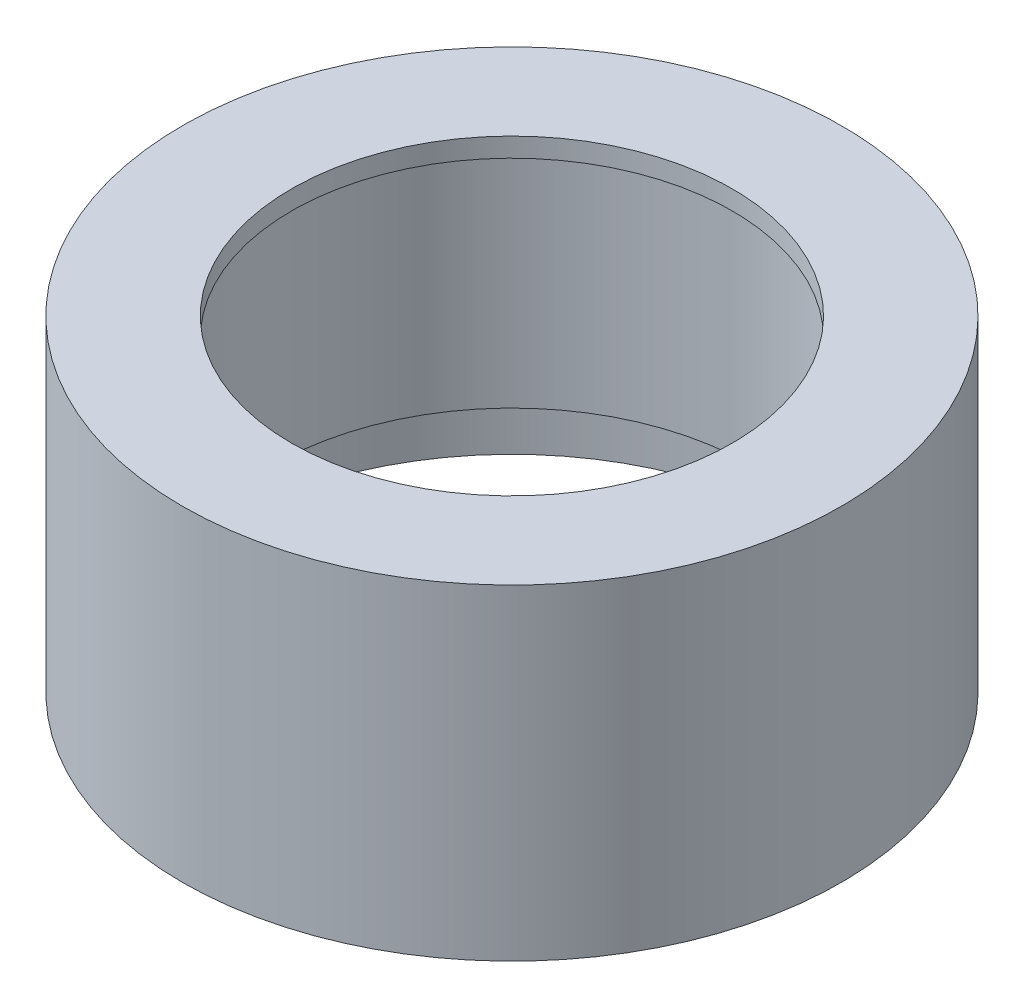
ISO-10303-21;
HEADER;
FILE_DESCRIPTION(('STEP AP214'),'2;1');
FILE_NAME('part.step','',(''),(''),'','','');
FILE_SCHEMA(('AUTOMOTIVE_DESIGN { 1 0 10303 214 1 1 1 1 }'));
ENDSEC;
DATA;
#1=APPLICATION_CONTEXT('core data for automotive mechanical design processes');
#2=APPLICATION_PROTOCOL_DEFINITION('international standard','automotive_design',2000,#1);
#3=PRODUCT_CONTEXT('',#1,'mechanical');
#4=PRODUCT('Part','Part','',(#3));
#5=PRODUCT_RELATED_PRODUCT_CATEGORY('part','',(#4));
#6=PRODUCT_DEFINITION_FORMATION('','',#4);
#7=PRODUCT_DEFINITION_CONTEXT('part definition',#1,'design');
#8=PRODUCT_DEFINITION('design','',#6,#7);
#9=PRODUCT_DEFINITION_SHAPE('','',#8);
#10=(LENGTH_UNIT() NAMED_UNIT(*) SI_UNIT(.MILLI.,.METRE.));
#11=(NAMED_UNIT(*) PLANE_ANGLE_UNIT() SI_UNIT($,.RADIAN.));
#12=(NAMED_UNIT(*) SI_UNIT($,.STERADIAN.) SOLID_ANGLE_UNIT());
#13=UNCERTAINTY_MEASURE_WITH_UNIT(LENGTH_MEASURE(1.E-05),#10,'distance_accuracy_value','');
#14=(GEOMETRIC_REPRESENTATION_CONTEXT(3) GLOBAL_UNCERTAINTY_ASSIGNED_CONTEXT((#13)) GLOBAL_UNIT_ASSIGNED_CONTEXT((#10,
#11,#12)) REPRESENTATION_CONTEXT('',''));
#15=CARTESIAN_POINT('',(0.,0.,0.));
#16=DIRECTION('',(0.,0.,1.));
#17=DIRECTION('',(1.,0.,0.));
#18=AXIS2_PLACEMENT_3D('',#15,#16,#17);
#19=CARTESIAN_POINT('',(0.,0.,0.));
#20=DIRECTION('',(0.,1.,0.));
#21=DIRECTION('',(0.,0.,1.));
#22=AXIS2_PLACEMENT_3D('',#19,#20,#21);
#23=PLANE('',#22);
#24=CARTESIAN_POINT('',(0.,0.,0.));
#25=DIRECTION('',(0.,1.,0.));
#26=DIRECTION('',(0.,0.,1.));
#27=AXIS2_PLACEMENT_3D('',#24,#25,#26);
#28=CIRCLE('',#27,8.6);
#29=CARTESIAN_POINT('',(0.,0.,8.6));
#30=VERTEX_POINT('',#29);
#31=EDGE_CURVE('E10',#30,#30,#28,.T.);
#32=ORIENTED_EDGE('',*,*,#31,.F.);
#33=EDGE_LOOP('',(#32));
#34=FACE_BOUND('',#33,.T.);
#35=CARTESIAN_POINT('',(0.,0.,0.));
#36=DIRECTION('',(0.,1.,0.));
#37=DIRECTION('',(0.,0.,1.));
#38=AXIS2_PLACEMENT_3D('',#35,#36,#37);
#39=CIRCLE('',#38,7.6);
#40=CARTESIAN_POINT('',(0.,0.,7.6));
#41=VERTEX_POINT('',#40);
#42=EDGE_CURVE('E37',#41,#41,#39,.T.);
#43=ORIENTED_EDGE('',*,*,#42,.T.);
#44=EDGE_LOOP('',(#43));
#45=FACE_BOUND('',#44,.T.);
#46=ADVANCED_FACE('F30',(#34,#45),#23,.F.);
#47=CARTESIAN_POINT('',(0.,2.,0.));
#48=DIRECTION('',(0.,-1.,0.));
#49=DIRECTION('',(0.,0.,-1.));
#50=AXIS2_PLACEMENT_3D('',#47,#48,#49);
#51=CYLINDRICAL_SURFACE('',#50,8.6);
#52=ORIENTED_EDGE('',*,*,#31,.T.);
#53=EDGE_LOOP('',(#52));
#54=FACE_BOUND('',#53,.T.);
#55=CARTESIAN_POINT('',(0.,8.5,0.));
#56=DIRECTION('',(0.,1.,0.));
#57=DIRECTION('',(0.,0.,1.));
#58=AXIS2_PLACEMENT_3D('',#55,#56,#57);
#59=CIRCLE('',#58,8.6);
#60=CARTESIAN_POINT('',(0.,8.5,8.6));
#61=VERTEX_POINT('',#60);
#62=EDGE_CURVE('E53',#61,#61,#59,.T.);
#63=ORIENTED_EDGE('',*,*,#62,.F.);
#64=EDGE_LOOP('',(#63));
#65=FACE_BOUND('',#64,.T.);
#66=ADVANCED_FACE('F32',(#54,#65),#51,.T.);
#67=CARTESIAN_POINT('',(0.,2.,0.));
#68=DIRECTION('',(0.,-1.,0.));
#69=DIRECTION('',(0.,0.,-1.));
#70=AXIS2_PLACEMENT_3D('',#67,#68,#69);
#71=CYLINDRICAL_SURFACE('',#70,7.6);
#72=CARTESIAN_POINT('',(0.,2.,0.));
#73=DIRECTION('',(0.,1.,0.));
#74=DIRECTION('',(0.,0.,1.));
#75=AXIS2_PLACEMENT_3D('',#72,#73,#74);
#76=CIRCLE('',#75,7.6);
#77=CARTESIAN_POINT('',(0.,2.,7.6));
#78=VERTEX_POINT('',#77);
#79=EDGE_CURVE('E41',#78,#78,#76,.T.);
#80=ORIENTED_EDGE('',*,*,#79,.T.);
#81=EDGE_LOOP('',(#80));
#82=FACE_BOUND('',#81,.T.);
#83=ORIENTED_EDGE('',*,*,#42,.F.);
#84=EDGE_LOOP('',(#83));
#85=FACE_BOUND('',#84,.T.);
#86=ADVANCED_FACE('F87',(#82,#85),#71,.F.);
#87=CARTESIAN_POINT('',(0.,2.,0.));
#88=DIRECTION('',(0.,1.,0.));
#89=DIRECTION('',(0.,0.,1.));
#90=AXIS2_PLACEMENT_3D('',#87,#88,#89);
#91=PLANE('',#90);
#92=ORIENTED_EDGE('',*,*,#79,.F.);
#93=EDGE_LOOP('',(#92));
#94=FACE_BOUND('',#93,.T.);
#95=CARTESIAN_POINT('',(0.,2.,0.));
#96=DIRECTION('',(0.,1.,0.));
#97=DIRECTION('',(0.,0.,1.));
#98=AXIS2_PLACEMENT_3D('',#95,#96,#97);
#99=CIRCLE('',#98,6.25);
#100=CARTESIAN_POINT('',(0.,2.,6.25));
#101=VERTEX_POINT('',#100);
#102=EDGE_CURVE('E45',#101,#101,#99,.T.);
#103=ORIENTED_EDGE('',*,*,#102,.T.);
#104=EDGE_LOOP('',(#103));
#105=FACE_BOUND('',#104,.T.);
#106=ADVANCED_FACE('F78',(#94,#105),#91,.F.);
#107=CARTESIAN_POINT('',(0.,8.,0.));
#108=DIRECTION('',(0.,-1.,0.));
#109=DIRECTION('',(0.,0.,-1.));
#110=AXIS2_PLACEMENT_3D('',#107,#108,#109);
#111=CYLINDRICAL_SURFACE('',#110,6.25);
#112=CARTESIAN_POINT('',(0.,8.,0.));
#113=DIRECTION('',(0.,1.,0.));
#114=DIRECTION('',(0.,0.,1.));
#115=AXIS2_PLACEMENT_3D('',#112,#113,#114);
#116=CIRCLE('',#115,6.25);
#117=CARTESIAN_POINT('',(0.,8.,6.25));
#118=VERTEX_POINT('',#117);
#119=EDGE_CURVE('E50',#118,#118,#116,.T.);
#120=ORIENTED_EDGE('',*,*,#119,.T.);
#121=EDGE_LOOP('',(#120));
#122=FACE_BOUND('',#121,.T.);
#123=ORIENTED_EDGE('',*,*,#102,.F.);
#124=EDGE_LOOP('',(#123));
#125=FACE_BOUND('',#124,.T.);
#126=ADVANCED_FACE('F69',(#122,#125),#111,.F.);
#127=CARTESIAN_POINT('',(0.,8.5,0.));
#128=DIRECTION('',(0.,1.,0.));
#129=DIRECTION('',(0.,0.,1.));
#130=AXIS2_PLACEMENT_3D('',#127,#128,#129);
#131=PLANE('',#130);
#132=ORIENTED_EDGE('',*,*,#62,.T.);
#133=EDGE_LOOP('',(#132));
#134=FACE_BOUND('',#133,.T.);
#135=CARTESIAN_POINT('',(0.,8.5,0.));
#136=DIRECTION('',(0.,1.,0.));
#137=DIRECTION('',(0.,0.,1.));
#138=AXIS2_PLACEMENT_3D('',#135,#136,#137);
#139=CIRCLE('',#138,5.75);
#140=CARTESIAN_POINT('',(0.,8.5,5.75));
#141=VERTEX_POINT('',#140);
#142=EDGE_CURVE('E56',#141,#141,#139,.T.);
#143=ORIENTED_EDGE('',*,*,#142,.F.);
#144=EDGE_LOOP('',(#143));
#145=FACE_BOUND('',#144,.T.);
#146=ADVANCED_FACE('F66',(#134,#145),#131,.T.);
#147=CARTESIAN_POINT('',(0.,8.,0.));
#148=DIRECTION('',(0.,1.,0.));
#149=DIRECTION('',(0.,0.,1.));
#150=AXIS2_PLACEMENT_3D('',#147,#148,#149);
#151=PLANE('',#150);
#152=ORIENTED_EDGE('',*,*,#119,.F.);
#153=EDGE_LOOP('',(#152));
#154=FACE_BOUND('',#153,.T.);
#155=CARTESIAN_POINT('',(0.,8.,0.));
#156=DIRECTION('',(0.,1.,0.));
#157=DIRECTION('',(0.,0.,1.));
#158=AXIS2_PLACEMENT_3D('',#155,#156,#157);
#159=CIRCLE('',#158,5.75);
#160=CARTESIAN_POINT('',(0.,8.,5.75));
#161=VERTEX_POINT('',#160);
#162=EDGE_CURVE('E57',#161,#161,#159,.T.);
#163=ORIENTED_EDGE('',*,*,#162,.T.);
#164=EDGE_LOOP('',(#163));
#165=FACE_BOUND('',#164,.T.);
#166=ADVANCED_FACE('F68',(#154,#165),#151,.F.);
#167=CARTESIAN_POINT('',(0.,8.5,0.));
#168=DIRECTION('',(0.,-1.,0.));
#169=DIRECTION('',(0.,0.,-1.));
#170=AXIS2_PLACEMENT_3D('',#167,#168,#169);
#171=CYLINDRICAL_SURFACE('',#170,5.75);
#172=ORIENTED_EDGE('',*,*,#142,.T.);
#173=EDGE_LOOP('',(#172));
#174=FACE_BOUND('',#173,.T.);
#175=ORIENTED_EDGE('',*,*,#162,.F.);
#176=EDGE_LOOP('',(#175));
#177=FACE_BOUND('',#176,.T.);
#178=ADVANCED_FACE('F63',(#174,#177),#171,.F.);
#179=CLOSED_SHELL('',(#46,#66,#86,#106,#126,#146,#166,#178));
#180=MANIFOLD_SOLID_BREP('B2',#179);
#181=ADVANCED_BREP_SHAPE_REPRESENTATION('',(#18,#180),#14);
#182=SHAPE_DEFINITION_REPRESENTATION(#9,#181);
ENDSEC;
END-ISO-10303-21;
